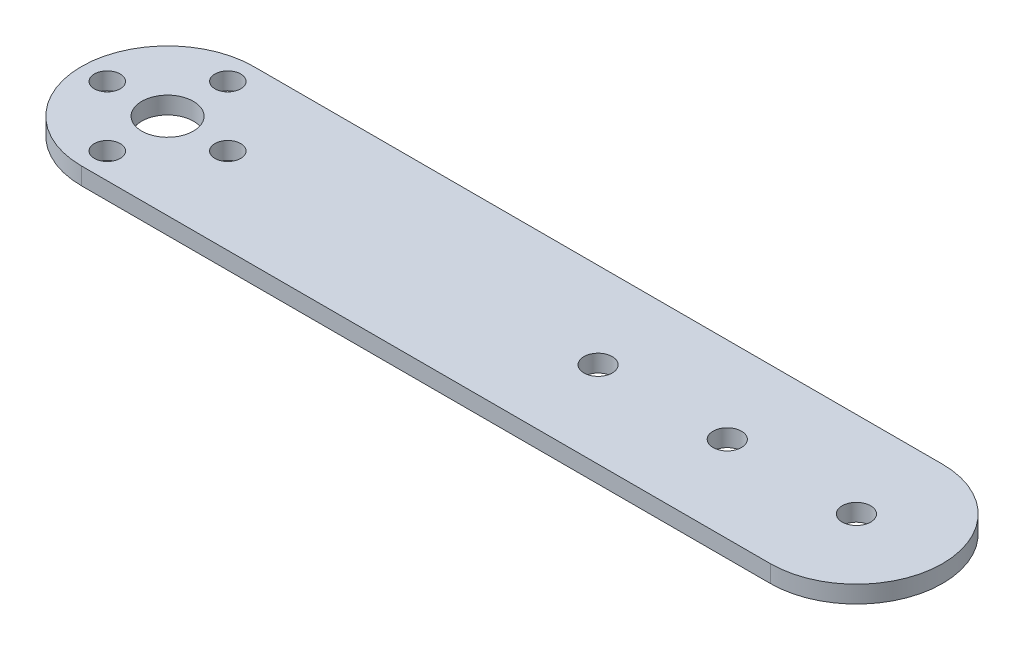
ISO-10303-21;
HEADER;
FILE_DESCRIPTION(('STEP AP214'),'2;1');
FILE_NAME('part.step','',(''),(''),'','','');
FILE_SCHEMA(('AUTOMOTIVE_DESIGN { 1 0 10303 214 1 1 1 1 }'));
ENDSEC;
DATA;
#1=APPLICATION_CONTEXT('core data for automotive mechanical design processes');
#2=APPLICATION_PROTOCOL_DEFINITION('international standard','automotive_design',2000,#1);
#3=PRODUCT_CONTEXT('',#1,'mechanical');
#4=PRODUCT('Part','Part','',(#3));
#5=PRODUCT_RELATED_PRODUCT_CATEGORY('part','',(#4));
#6=PRODUCT_DEFINITION_FORMATION('','',#4);
#7=PRODUCT_DEFINITION_CONTEXT('part definition',#1,'design');
#8=PRODUCT_DEFINITION('design','',#6,#7);
#9=PRODUCT_DEFINITION_SHAPE('','',#8);
#10=(LENGTH_UNIT() NAMED_UNIT(*) SI_UNIT(.MILLI.,.METRE.));
#11=(NAMED_UNIT(*) PLANE_ANGLE_UNIT() SI_UNIT($,.RADIAN.));
#12=(NAMED_UNIT(*) SI_UNIT($,.STERADIAN.) SOLID_ANGLE_UNIT());
#13=UNCERTAINTY_MEASURE_WITH_UNIT(LENGTH_MEASURE(1.E-05),#10,'distance_accuracy_value','');
#14=(GEOMETRIC_REPRESENTATION_CONTEXT(3) GLOBAL_UNCERTAINTY_ASSIGNED_CONTEXT((#13)) GLOBAL_UNIT_ASSIGNED_CONTEXT((#10,
#11,#12)) REPRESENTATION_CONTEXT('',''));
#15=CARTESIAN_POINT('',(0.,0.,0.));
#16=DIRECTION('',(0.,0.,1.));
#17=DIRECTION('',(1.,0.,0.));
#18=AXIS2_PLACEMENT_3D('',#15,#16,#17);
#19=CARTESIAN_POINT('',(0.,2.,0.));
#20=DIRECTION('',(0.,1.,0.));
#21=DIRECTION('',(0.,0.,1.));
#22=AXIS2_PLACEMENT_3D('',#19,#20,#21);
#23=PLANE('',#22);
#24=CARTESIAN_POINT('',(50.,2.,0.));
#25=DIRECTION('',(0.,1.,0.));
#26=DIRECTION('',(0.,0.,1.));
#27=AXIS2_PLACEMENT_3D('',#24,#25,#26);
#28=CIRCLE('',#27,1.65);
#29=CARTESIAN_POINT('',(50.,2.,1.65));
#30=VERTEX_POINT('',#29);
#31=EDGE_CURVE('E146',#30,#30,#28,.T.);
#32=ORIENTED_EDGE('',*,*,#31,.F.);
#33=EDGE_LOOP('',(#32));
#34=FACE_BOUND('',#33,.T.);
#35=CARTESIAN_POINT('',(80.,2.,0.));
#36=DIRECTION('',(0.,1.,0.));
#37=DIRECTION('',(0.,0.,1.));
#38=AXIS2_PLACEMENT_3D('',#35,#36,#37);
#39=CIRCLE('',#38,1.65);
#40=CARTESIAN_POINT('',(80.,2.,1.65));
#41=VERTEX_POINT('',#40);
#42=EDGE_CURVE('E134',#41,#41,#39,.T.);
#43=ORIENTED_EDGE('',*,*,#42,.F.);
#44=EDGE_LOOP('',(#43));
#45=FACE_BOUND('',#44,.T.);
#46=CARTESIAN_POINT('',(0.,2.,7.));
#47=DIRECTION('',(0.,1.,0.));
#48=DIRECTION('',(0.,0.,1.));
#49=AXIS2_PLACEMENT_3D('',#46,#47,#48);
#50=CIRCLE('',#49,1.5);
#51=CARTESIAN_POINT('',(0.,2.,8.5));
#52=VERTEX_POINT('',#51);
#53=EDGE_CURVE('E122',#52,#52,#50,.T.);
#54=ORIENTED_EDGE('',*,*,#53,.F.);
#55=EDGE_LOOP('',(#54));
#56=FACE_BOUND('',#55,.T.);
#57=CARTESIAN_POINT('',(0.,2.,-7.));
#58=DIRECTION('',(0.,1.,0.));
#59=DIRECTION('',(0.,0.,1.));
#60=AXIS2_PLACEMENT_3D('',#57,#58,#59);
#61=CIRCLE('',#60,1.5);
#62=CARTESIAN_POINT('',(0.,2.,-5.5));
#63=VERTEX_POINT('',#62);
#64=EDGE_CURVE('E101',#63,#63,#61,.T.);
#65=ORIENTED_EDGE('',*,*,#64,.F.);
#66=EDGE_LOOP('',(#65));
#67=FACE_BOUND('',#66,.T.);
#68=CARTESIAN_POINT('',(0.,2.,0.));
#69=DIRECTION('',(0.,1.,0.));
#70=DIRECTION('',(0.,0.,1.));
#71=AXIS2_PLACEMENT_3D('',#68,#69,#70);
#72=CIRCLE('',#71,10.);
#73=CARTESIAN_POINT('',(0.,2.,-10.));
#74=VERTEX_POINT('',#73);
#75=CARTESIAN_POINT('',(0.,2.,10.));
#76=VERTEX_POINT('',#75);
#77=EDGE_CURVE('E86',#74,#76,#72,.T.);
#78=ORIENTED_EDGE('',*,*,#77,.T.);
#79=DIRECTION('',(1.,0.,0.));
#80=VECTOR('',#79,1.);
#81=CARTESIAN_POINT('',(0.,2.,10.));
#82=LINE('',#81,#80);
#83=CARTESIAN_POINT('',(80.,2.,10.));
#84=VERTEX_POINT('',#83);
#85=EDGE_CURVE('E81',#76,#84,#82,.T.);
#86=ORIENTED_EDGE('',*,*,#85,.T.);
#87=CARTESIAN_POINT('',(80.,2.,0.));
#88=DIRECTION('',(0.,1.,0.));
#89=DIRECTION('',(0.,0.,-1.));
#90=AXIS2_PLACEMENT_3D('',#87,#88,#89);
#91=CIRCLE('',#90,10.);
#92=CARTESIAN_POINT('',(80.,2.,-10.));
#93=VERTEX_POINT('',#92);
#94=EDGE_CURVE('E84',#84,#93,#91,.T.);
#95=ORIENTED_EDGE('',*,*,#94,.T.);
#96=DIRECTION('',(-1.,0.,0.));
#97=VECTOR('',#96,1.);
#98=CARTESIAN_POINT('',(0.,2.,-10.));
#99=LINE('',#98,#97);
#100=EDGE_CURVE('E51',#93,#74,#99,.T.);
#101=ORIENTED_EDGE('',*,*,#100,.T.);
#102=EDGE_LOOP('',(#78,#86,#95,#101));
#103=FACE_BOUND('',#102,.T.);
#104=CARTESIAN_POINT('',(7.,2.,0.));
#105=DIRECTION('',(0.,1.,0.));
#106=DIRECTION('',(0.,0.,1.));
#107=AXIS2_PLACEMENT_3D('',#104,#105,#106);
#108=CIRCLE('',#107,1.5);
#109=CARTESIAN_POINT('',(7.,2.,1.5));
#110=VERTEX_POINT('',#109);
#111=EDGE_CURVE('E116',#110,#110,#108,.T.);
#112=ORIENTED_EDGE('',*,*,#111,.F.);
#113=EDGE_LOOP('',(#112));
#114=FACE_BOUND('',#113,.T.);
#115=CARTESIAN_POINT('',(-7.,2.,0.));
#116=DIRECTION('',(0.,1.,0.));
#117=DIRECTION('',(0.,0.,1.));
#118=AXIS2_PLACEMENT_3D('',#115,#116,#117);
#119=CIRCLE('',#118,1.5);
#120=CARTESIAN_POINT('',(-7.,2.,1.5));
#121=VERTEX_POINT('',#120);
#122=EDGE_CURVE('E128',#121,#121,#119,.T.);
#123=ORIENTED_EDGE('',*,*,#122,.F.);
#124=EDGE_LOOP('',(#123));
#125=FACE_BOUND('',#124,.T.);
#126=CARTESIAN_POINT('',(0.,2.,0.));
#127=DIRECTION('',(0.,1.,0.));
#128=DIRECTION('',(0.,0.,1.));
#129=AXIS2_PLACEMENT_3D('',#126,#127,#128);
#130=CIRCLE('',#129,3.);
#131=CARTESIAN_POINT('',(0.,2.,3.));
#132=VERTEX_POINT('',#131);
#133=EDGE_CURVE('E140',#132,#132,#130,.T.);
#134=ORIENTED_EDGE('',*,*,#133,.F.);
#135=EDGE_LOOP('',(#134));
#136=FACE_BOUND('',#135,.T.);
#137=CARTESIAN_POINT('',(65.,2.,0.));
#138=DIRECTION('',(0.,1.,0.));
#139=DIRECTION('',(0.,0.,1.));
#140=AXIS2_PLACEMENT_3D('',#137,#138,#139);
#141=CIRCLE('',#140,1.65);
#142=CARTESIAN_POINT('',(65.,2.,1.65));
#143=VERTEX_POINT('',#142);
#144=EDGE_CURVE('E152',#143,#143,#141,.T.);
#145=ORIENTED_EDGE('',*,*,#144,.F.);
#146=EDGE_LOOP('',(#145));
#147=FACE_BOUND('',#146,.T.);
#148=ADVANCED_FACE('F34',(#34,#45,#56,#67,#103,#114,#125,#136,#147),#23,.T.);
#149=CARTESIAN_POINT('',(0.,0.,0.));
#150=DIRECTION('',(0.,1.,0.));
#151=DIRECTION('',(0.,0.,1.));
#152=AXIS2_PLACEMENT_3D('',#149,#150,#151);
#153=PLANE('',#152);
#154=CARTESIAN_POINT('',(0.,0.,0.));
#155=DIRECTION('',(0.,1.,0.));
#156=DIRECTION('',(0.,0.,1.));
#157=AXIS2_PLACEMENT_3D('',#154,#155,#156);
#158=CIRCLE('',#157,10.);
#159=CARTESIAN_POINT('',(0.,0.,-10.));
#160=VERTEX_POINT('',#159);
#161=CARTESIAN_POINT('',(0.,0.,10.));
#162=VERTEX_POINT('',#161);
#163=EDGE_CURVE('E98',#160,#162,#158,.T.);
#164=ORIENTED_EDGE('',*,*,#163,.F.);
#165=DIRECTION('',(-1.,0.,0.));
#166=VECTOR('',#165,1.);
#167=CARTESIAN_POINT('',(0.,0.,-10.));
#168=LINE('',#167,#166);
#169=CARTESIAN_POINT('',(80.,0.,-10.));
#170=VERTEX_POINT('',#169);
#171=EDGE_CURVE('E74',#170,#160,#168,.T.);
#172=ORIENTED_EDGE('',*,*,#171,.F.);
#173=CARTESIAN_POINT('',(80.,0.,0.));
#174=DIRECTION('',(0.,1.,0.));
#175=DIRECTION('',(0.,0.,-1.));
#176=AXIS2_PLACEMENT_3D('',#173,#174,#175);
#177=CIRCLE('',#176,10.);
#178=CARTESIAN_POINT('',(80.,0.,10.));
#179=VERTEX_POINT('',#178);
#180=EDGE_CURVE('E68',#179,#170,#177,.T.);
#181=ORIENTED_EDGE('',*,*,#180,.F.);
#182=DIRECTION('',(1.,0.,0.));
#183=VECTOR('',#182,1.);
#184=CARTESIAN_POINT('',(0.,0.,10.));
#185=LINE('',#184,#183);
#186=EDGE_CURVE('E90',#162,#179,#185,.T.);
#187=ORIENTED_EDGE('',*,*,#186,.F.);
#188=EDGE_LOOP('',(#164,#172,#181,#187));
#189=FACE_BOUND('',#188,.T.);
#190=CARTESIAN_POINT('',(0.,0.,-7.));
#191=DIRECTION('',(0.,1.,0.));
#192=DIRECTION('',(0.,0.,1.));
#193=AXIS2_PLACEMENT_3D('',#190,#191,#192);
#194=CIRCLE('',#193,1.5);
#195=CARTESIAN_POINT('',(0.,0.,-5.5));
#196=VERTEX_POINT('',#195);
#197=EDGE_CURVE('E113',#196,#196,#194,.T.);
#198=ORIENTED_EDGE('',*,*,#197,.T.);
#199=EDGE_LOOP('',(#198));
#200=FACE_BOUND('',#199,.T.);
#201=CARTESIAN_POINT('',(7.,0.,0.));
#202=DIRECTION('',(0.,1.,0.));
#203=DIRECTION('',(0.,0.,1.));
#204=AXIS2_PLACEMENT_3D('',#201,#202,#203);
#205=CIRCLE('',#204,1.5);
#206=CARTESIAN_POINT('',(7.,0.,1.5));
#207=VERTEX_POINT('',#206);
#208=EDGE_CURVE('E119',#207,#207,#205,.T.);
#209=ORIENTED_EDGE('',*,*,#208,.T.);
#210=EDGE_LOOP('',(#209));
#211=FACE_BOUND('',#210,.T.);
#212=CARTESIAN_POINT('',(0.,0.,7.));
#213=DIRECTION('',(0.,1.,0.));
#214=DIRECTION('',(0.,0.,1.));
#215=AXIS2_PLACEMENT_3D('',#212,#213,#214);
#216=CIRCLE('',#215,1.5);
#217=CARTESIAN_POINT('',(0.,0.,8.5));
#218=VERTEX_POINT('',#217);
#219=EDGE_CURVE('E125',#218,#218,#216,.T.);
#220=ORIENTED_EDGE('',*,*,#219,.T.);
#221=EDGE_LOOP('',(#220));
#222=FACE_BOUND('',#221,.T.);
#223=CARTESIAN_POINT('',(-7.,0.,0.));
#224=DIRECTION('',(0.,1.,0.));
#225=DIRECTION('',(0.,0.,1.));
#226=AXIS2_PLACEMENT_3D('',#223,#224,#225);
#227=CIRCLE('',#226,1.5);
#228=CARTESIAN_POINT('',(-7.,0.,1.5));
#229=VERTEX_POINT('',#228);
#230=EDGE_CURVE('E131',#229,#229,#227,.T.);
#231=ORIENTED_EDGE('',*,*,#230,.T.);
#232=EDGE_LOOP('',(#231));
#233=FACE_BOUND('',#232,.T.);
#234=CARTESIAN_POINT('',(80.,0.,0.));
#235=DIRECTION('',(0.,1.,0.));
#236=DIRECTION('',(0.,0.,1.));
#237=AXIS2_PLACEMENT_3D('',#234,#235,#236);
#238=CIRCLE('',#237,1.65);
#239=CARTESIAN_POINT('',(80.,0.,1.65));
#240=VERTEX_POINT('',#239);
#241=EDGE_CURVE('E137',#240,#240,#238,.T.);
#242=ORIENTED_EDGE('',*,*,#241,.T.);
#243=EDGE_LOOP('',(#242));
#244=FACE_BOUND('',#243,.T.);
#245=CARTESIAN_POINT('',(0.,0.,0.));
#246=DIRECTION('',(0.,1.,0.));
#247=DIRECTION('',(0.,0.,1.));
#248=AXIS2_PLACEMENT_3D('',#245,#246,#247);
#249=CIRCLE('',#248,3.);
#250=CARTESIAN_POINT('',(0.,0.,3.));
#251=VERTEX_POINT('',#250);
#252=EDGE_CURVE('E143',#251,#251,#249,.T.);
#253=ORIENTED_EDGE('',*,*,#252,.T.);
#254=EDGE_LOOP('',(#253));
#255=FACE_BOUND('',#254,.T.);
#256=CARTESIAN_POINT('',(50.,0.,0.));
#257=DIRECTION('',(0.,1.,0.));
#258=DIRECTION('',(0.,0.,1.));
#259=AXIS2_PLACEMENT_3D('',#256,#257,#258);
#260=CIRCLE('',#259,1.65);
#261=CARTESIAN_POINT('',(50.,0.,1.65));
#262=VERTEX_POINT('',#261);
#263=EDGE_CURVE('E149',#262,#262,#260,.T.);
#264=ORIENTED_EDGE('',*,*,#263,.T.);
#265=EDGE_LOOP('',(#264));
#266=FACE_BOUND('',#265,.T.);
#267=CARTESIAN_POINT('',(65.,0.,0.));
#268=DIRECTION('',(0.,1.,0.));
#269=DIRECTION('',(0.,0.,1.));
#270=AXIS2_PLACEMENT_3D('',#267,#268,#269);
#271=CIRCLE('',#270,1.65);
#272=CARTESIAN_POINT('',(65.,0.,1.65));
#273=VERTEX_POINT('',#272);
#274=EDGE_CURVE('E155',#273,#273,#271,.T.);
#275=ORIENTED_EDGE('',*,*,#274,.T.);
#276=EDGE_LOOP('',(#275));
#277=FACE_BOUND('',#276,.T.);
#278=ADVANCED_FACE('F109',(#189,#200,#211,#222,#233,#244,#255,#266,#277),#153,.F.);
#279=CARTESIAN_POINT('',(0.,2.,0.));
#280=DIRECTION('',(0.,-1.,0.));
#281=DIRECTION('',(0.,0.,-1.));
#282=AXIS2_PLACEMENT_3D('',#279,#280,#281);
#283=CYLINDRICAL_SURFACE('',#282,10.);
#284=ORIENTED_EDGE('',*,*,#163,.T.);
#285=DIRECTION('',(0.,-1.,0.));
#286=VECTOR('',#285,1.);
#287=CARTESIAN_POINT('',(0.,2.,10.));
#288=LINE('',#287,#286);
#289=EDGE_CURVE('E11',#76,#162,#288,.T.);
#290=ORIENTED_EDGE('',*,*,#289,.F.);
#291=ORIENTED_EDGE('',*,*,#77,.F.);
#292=DIRECTION('',(0.,-1.,0.));
#293=VECTOR('',#292,1.);
#294=CARTESIAN_POINT('',(0.,2.,-10.));
#295=LINE('',#294,#293);
#296=EDGE_CURVE('E94',#74,#160,#295,.T.);
#297=ORIENTED_EDGE('',*,*,#296,.T.);
#298=EDGE_LOOP('',(#284,#290,#291,#297));
#299=FACE_BOUND('',#298,.T.);
#300=ADVANCED_FACE('F36',(#299),#283,.T.);
#301=CARTESIAN_POINT('',(0.,2.,10.));
#302=DIRECTION('',(0.,0.,-1.));
#303=DIRECTION('',(-1.,0.,0.));
#304=AXIS2_PLACEMENT_3D('',#301,#302,#303);
#305=PLANE('',#304);
#306=ORIENTED_EDGE('',*,*,#186,.T.);
#307=DIRECTION('',(0.,-1.,0.));
#308=VECTOR('',#307,1.);
#309=CARTESIAN_POINT('',(80.,2.,10.));
#310=LINE('',#309,#308);
#311=EDGE_CURVE('E43',#84,#179,#310,.T.);
#312=ORIENTED_EDGE('',*,*,#311,.F.);
#313=ORIENTED_EDGE('',*,*,#85,.F.);
#314=ORIENTED_EDGE('',*,*,#289,.T.);
#315=EDGE_LOOP('',(#306,#312,#313,#314));
#316=FACE_BOUND('',#315,.T.);
#317=ADVANCED_FACE('F89',(#316),#305,.F.);
#318=CARTESIAN_POINT('',(80.,2.,0.));
#319=DIRECTION('',(0.,-1.,0.));
#320=DIRECTION('',(0.,0.,-1.));
#321=AXIS2_PLACEMENT_3D('',#318,#319,#320);
#322=CYLINDRICAL_SURFACE('',#321,10.);
#323=ORIENTED_EDGE('',*,*,#180,.T.);
#324=DIRECTION('',(0.,-1.,0.));
#325=VECTOR('',#324,1.);
#326=CARTESIAN_POINT('',(80.,2.,-10.));
#327=LINE('',#326,#325);
#328=EDGE_CURVE('E91',#93,#170,#327,.T.);
#329=ORIENTED_EDGE('',*,*,#328,.F.);
#330=ORIENTED_EDGE('',*,*,#94,.F.);
#331=ORIENTED_EDGE('',*,*,#311,.T.);
#332=EDGE_LOOP('',(#323,#329,#330,#331));
#333=FACE_BOUND('',#332,.T.);
#334=ADVANCED_FACE('F92',(#333),#322,.T.);
#335=CARTESIAN_POINT('',(0.,2.,-10.));
#336=DIRECTION('',(0.,0.,1.));
#337=DIRECTION('',(1.,0.,0.));
#338=AXIS2_PLACEMENT_3D('',#335,#336,#337);
#339=PLANE('',#338);
#340=ORIENTED_EDGE('',*,*,#171,.T.);
#341=ORIENTED_EDGE('',*,*,#296,.F.);
#342=ORIENTED_EDGE('',*,*,#100,.F.);
#343=ORIENTED_EDGE('',*,*,#328,.T.);
#344=EDGE_LOOP('',(#340,#341,#342,#343));
#345=FACE_BOUND('',#344,.T.);
#346=ADVANCED_FACE('F106',(#345),#339,.F.);
#347=CARTESIAN_POINT('',(0.,2.,-7.));
#348=DIRECTION('',(0.,-1.,0.));
#349=DIRECTION('',(0.,0.,-1.));
#350=AXIS2_PLACEMENT_3D('',#347,#348,#349);
#351=CYLINDRICAL_SURFACE('',#350,1.5);
#352=ORIENTED_EDGE('',*,*,#64,.T.);
#353=EDGE_LOOP('',(#352));
#354=FACE_BOUND('',#353,.T.);
#355=ORIENTED_EDGE('',*,*,#197,.F.);
#356=EDGE_LOOP('',(#355));
#357=FACE_BOUND('',#356,.T.);
#358=ADVANCED_FACE('F174',(#354,#357),#351,.F.);
#359=CARTESIAN_POINT('',(7.,2.,0.));
#360=DIRECTION('',(0.,-1.,0.));
#361=DIRECTION('',(0.,0.,-1.));
#362=AXIS2_PLACEMENT_3D('',#359,#360,#361);
#363=CYLINDRICAL_SURFACE('',#362,1.5);
#364=ORIENTED_EDGE('',*,*,#111,.T.);
#365=EDGE_LOOP('',(#364));
#366=FACE_BOUND('',#365,.T.);
#367=ORIENTED_EDGE('',*,*,#208,.F.);
#368=EDGE_LOOP('',(#367));
#369=FACE_BOUND('',#368,.T.);
#370=ADVANCED_FACE('F220',(#366,#369),#363,.F.);
#371=CARTESIAN_POINT('',(0.,2.,7.));
#372=DIRECTION('',(0.,-1.,0.));
#373=DIRECTION('',(0.,0.,-1.));
#374=AXIS2_PLACEMENT_3D('',#371,#372,#373);
#375=CYLINDRICAL_SURFACE('',#374,1.5);
#376=ORIENTED_EDGE('',*,*,#53,.T.);
#377=EDGE_LOOP('',(#376));
#378=FACE_BOUND('',#377,.T.);
#379=ORIENTED_EDGE('',*,*,#219,.F.);
#380=EDGE_LOOP('',(#379));
#381=FACE_BOUND('',#380,.T.);
#382=ADVANCED_FACE('F228',(#378,#381),#375,.F.);
#383=CARTESIAN_POINT('',(-7.,2.,0.));
#384=DIRECTION('',(0.,-1.,0.));
#385=DIRECTION('',(0.,0.,-1.));
#386=AXIS2_PLACEMENT_3D('',#383,#384,#385);
#387=CYLINDRICAL_SURFACE('',#386,1.5);
#388=ORIENTED_EDGE('',*,*,#122,.T.);
#389=EDGE_LOOP('',(#388));
#390=FACE_BOUND('',#389,.T.);
#391=ORIENTED_EDGE('',*,*,#230,.F.);
#392=EDGE_LOOP('',(#391));
#393=FACE_BOUND('',#392,.T.);
#394=ADVANCED_FACE('F236',(#390,#393),#387,.F.);
#395=CARTESIAN_POINT('',(80.,2.,0.));
#396=DIRECTION('',(0.,-1.,0.));
#397=DIRECTION('',(0.,0.,-1.));
#398=AXIS2_PLACEMENT_3D('',#395,#396,#397);
#399=CYLINDRICAL_SURFACE('',#398,1.65);
#400=ORIENTED_EDGE('',*,*,#42,.T.);
#401=EDGE_LOOP('',(#400));
#402=FACE_BOUND('',#401,.T.);
#403=ORIENTED_EDGE('',*,*,#241,.F.);
#404=EDGE_LOOP('',(#403));
#405=FACE_BOUND('',#404,.T.);
#406=ADVANCED_FACE('F245',(#402,#405),#399,.F.);
#407=CARTESIAN_POINT('',(0.,2.,0.));
#408=DIRECTION('',(0.,-1.,0.));
#409=DIRECTION('',(0.,0.,-1.));
#410=AXIS2_PLACEMENT_3D('',#407,#408,#409);
#411=CYLINDRICAL_SURFACE('',#410,3.);
#412=ORIENTED_EDGE('',*,*,#133,.T.);
#413=EDGE_LOOP('',(#412));
#414=FACE_BOUND('',#413,.T.);
#415=ORIENTED_EDGE('',*,*,#252,.F.);
#416=EDGE_LOOP('',(#415));
#417=FACE_BOUND('',#416,.T.);
#418=ADVANCED_FACE('F254',(#414,#417),#411,.F.);
#419=CARTESIAN_POINT('',(50.,2.,0.));
#420=DIRECTION('',(0.,-1.,0.));
#421=DIRECTION('',(0.,0.,-1.));
#422=AXIS2_PLACEMENT_3D('',#419,#420,#421);
#423=CYLINDRICAL_SURFACE('',#422,1.65);
#424=ORIENTED_EDGE('',*,*,#31,.T.);
#425=EDGE_LOOP('',(#424));
#426=FACE_BOUND('',#425,.T.);
#427=ORIENTED_EDGE('',*,*,#263,.F.);
#428=EDGE_LOOP('',(#427));
#429=FACE_BOUND('',#428,.T.);
#430=ADVANCED_FACE('F263',(#426,#429),#423,.F.);
#431=CARTESIAN_POINT('',(65.,2.,0.));
#432=DIRECTION('',(0.,-1.,0.));
#433=DIRECTION('',(0.,0.,-1.));
#434=AXIS2_PLACEMENT_3D('',#431,#432,#433);
#435=CYLINDRICAL_SURFACE('',#434,1.65);
#436=ORIENTED_EDGE('',*,*,#144,.T.);
#437=EDGE_LOOP('',(#436));
#438=FACE_BOUND('',#437,.T.);
#439=ORIENTED_EDGE('',*,*,#274,.F.);
#440=EDGE_LOOP('',(#439));
#441=FACE_BOUND('',#440,.T.);
#442=ADVANCED_FACE('F161',(#438,#441),#435,.F.);
#443=CLOSED_SHELL('',(#148,#278,#300,#317,#334,#346,#358,#370,#382,#394,#406,#418,#430,#442));
#444=MANIFOLD_SOLID_BREP('B2',#443);
#445=ADVANCED_BREP_SHAPE_REPRESENTATION('',(#18,#444),#14);
#446=SHAPE_DEFINITION_REPRESENTATION(#9,#445);
ENDSEC;
END-ISO-10303-21;
